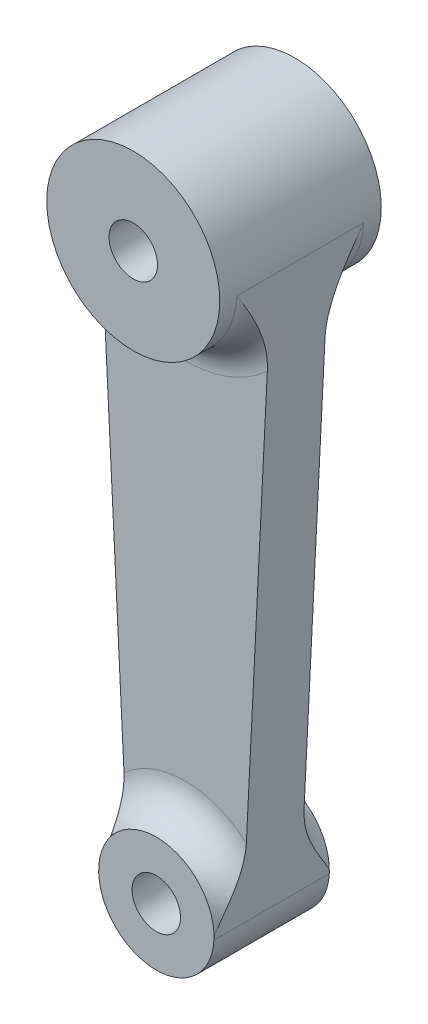
ISO-10303-21;
HEADER;
FILE_DESCRIPTION(('STEP AP214'),'2;1');
FILE_NAME('part.step','',(''),(''),'','','');
FILE_SCHEMA(('AUTOMOTIVE_DESIGN { 1 0 10303 214 1 1 1 1 }'));
ENDSEC;
DATA;
#1=APPLICATION_CONTEXT('core data for automotive mechanical design processes');
#2=APPLICATION_PROTOCOL_DEFINITION('international standard','automotive_design',2000,#1);
#3=PRODUCT_CONTEXT('',#1,'mechanical');
#4=PRODUCT('Part','Part','',(#3));
#5=PRODUCT_RELATED_PRODUCT_CATEGORY('part','',(#4));
#6=PRODUCT_DEFINITION_FORMATION('','',#4);
#7=PRODUCT_DEFINITION_CONTEXT('part definition',#1,'design');
#8=PRODUCT_DEFINITION('design','',#6,#7);
#9=PRODUCT_DEFINITION_SHAPE('','',#8);
#10=(LENGTH_UNIT() NAMED_UNIT(*) SI_UNIT(.MILLI.,.METRE.));
#11=(NAMED_UNIT(*) PLANE_ANGLE_UNIT() SI_UNIT($,.RADIAN.));
#12=(NAMED_UNIT(*) SI_UNIT($,.STERADIAN.) SOLID_ANGLE_UNIT());
#13=UNCERTAINTY_MEASURE_WITH_UNIT(LENGTH_MEASURE(1.E-05),#10,'distance_accuracy_value','');
#14=(GEOMETRIC_REPRESENTATION_CONTEXT(3) GLOBAL_UNCERTAINTY_ASSIGNED_CONTEXT((#13)) GLOBAL_UNIT_ASSIGNED_CONTEXT((#10,
#11,#12)) REPRESENTATION_CONTEXT('',''));
#15=CARTESIAN_POINT('',(0.,0.,0.));
#16=DIRECTION('',(0.,0.,1.));
#17=DIRECTION('',(1.,0.,0.));
#18=AXIS2_PLACEMENT_3D('',#15,#16,#17);
#19=CARTESIAN_POINT('',(0.,0.,7.));
#20=DIRECTION('',(0.,0.,-1.));
#21=DIRECTION('',(-1.,0.,0.));
#22=AXIS2_PLACEMENT_3D('',#19,#20,#21);
#23=CYLINDRICAL_SURFACE('',#22,7.5);
#24=CARTESIAN_POINT('',(0.,0.,-5.5));
#25=DIRECTION('',(0.,0.,1.));
#26=DIRECTION('',(1.,0.,0.));
#27=AXIS2_PLACEMENT_3D('',#24,#25,#26);
#28=CIRCLE('',#27,7.5);
#29=CARTESIAN_POINT('',(7.49061913328932,-0.375,-5.5));
#30=VERTEX_POINT('',#29);
#31=CARTESIAN_POINT('',(-7.49061913328932,-0.375,-5.5));
#32=VERTEX_POINT('',#31);
#33=EDGE_CURVE('E191',#30,#32,#28,.F.);
#34=ORIENTED_EDGE('',*,*,#33,.T.);
#35=DIRECTION('',(0.,0.,-1.));
#36=VECTOR('',#35,1.);
#37=CARTESIAN_POINT('',(-7.49061913328932,-0.375,2.5));
#38=LINE('',#37,#36);
#39=CARTESIAN_POINT('',(-7.49061913328932,-0.375,5.5));
#40=VERTEX_POINT('',#39);
#41=EDGE_CURVE('E66',#40,#32,#38,.T.);
#42=ORIENTED_EDGE('',*,*,#41,.F.);
#43=CARTESIAN_POINT('',(0.,0.,5.5));
#44=DIRECTION('',(0.,0.,1.));
#45=DIRECTION('',(1.,0.,0.));
#46=AXIS2_PLACEMENT_3D('',#43,#44,#45);
#47=CIRCLE('',#46,7.5);
#48=CARTESIAN_POINT('',(7.49061913328932,-0.375,5.5));
#49=VERTEX_POINT('',#48);
#50=EDGE_CURVE('E119',#40,#49,#47,.T.);
#51=ORIENTED_EDGE('',*,*,#50,.T.);
#52=DIRECTION('',(0.,0.,-1.));
#53=VECTOR('',#52,1.);
#54=CARTESIAN_POINT('',(7.49061913328932,-0.375,2.5));
#55=LINE('',#54,#53);
#56=EDGE_CURVE('E74',#49,#30,#55,.T.);
#57=ORIENTED_EDGE('',*,*,#56,.T.);
#58=EDGE_LOOP('',(#34,#42,#51,#57));
#59=FACE_BOUND('',#58,.T.);
#60=CARTESIAN_POINT('',(0.,0.,7.));
#61=DIRECTION('',(0.,0.,1.));
#62=DIRECTION('',(1.,0.,0.));
#63=AXIS2_PLACEMENT_3D('',#60,#61,#62);
#64=CIRCLE('',#63,7.5);
#65=CARTESIAN_POINT('',(7.5,0.,7.));
#66=VERTEX_POINT('',#65);
#67=EDGE_CURVE('E134',#66,#66,#64,.T.);
#68=ORIENTED_EDGE('',*,*,#67,.F.);
#69=EDGE_LOOP('',(#68));
#70=FACE_BOUND('',#69,.T.);
#71=CARTESIAN_POINT('',(0.,0.,-7.));
#72=DIRECTION('',(0.,0.,1.));
#73=DIRECTION('',(1.,0.,0.));
#74=AXIS2_PLACEMENT_3D('',#71,#72,#73);
#75=CIRCLE('',#74,7.5);
#76=CARTESIAN_POINT('',(7.5,0.,-7.));
#77=VERTEX_POINT('',#76);
#78=EDGE_CURVE('E174',#77,#77,#75,.T.);
#79=ORIENTED_EDGE('',*,*,#78,.T.);
#80=EDGE_LOOP('',(#79));
#81=FACE_BOUND('',#80,.T.);
#82=ADVANCED_FACE('F44',(#59,#70,#81),#23,.T.);
#83=CARTESIAN_POINT('',(0.,0.,7.));
#84=DIRECTION('',(0.,0.,1.));
#85=DIRECTION('',(1.,0.,0.));
#86=AXIS2_PLACEMENT_3D('',#83,#84,#85);
#87=PLANE('',#86);
#88=CARTESIAN_POINT('',(0.,0.,7.));
#89=DIRECTION('',(0.,0.,1.));
#90=DIRECTION('',(1.,0.,0.));
#91=AXIS2_PLACEMENT_3D('',#88,#89,#90);
#92=CIRCLE('',#91,2.1);
#93=CARTESIAN_POINT('',(2.1,0.,7.));
#94=VERTEX_POINT('',#93);
#95=EDGE_CURVE('E170',#94,#94,#92,.T.);
#96=ORIENTED_EDGE('',*,*,#95,.F.);
#97=EDGE_LOOP('',(#96));
#98=FACE_BOUND('',#97,.T.);
#99=ORIENTED_EDGE('',*,*,#67,.T.);
#100=EDGE_LOOP('',(#99));
#101=FACE_BOUND('',#100,.T.);
#102=ADVANCED_FACE('F320',(#98,#101),#87,.T.);
#103=CARTESIAN_POINT('',(0.,0.,-7.));
#104=DIRECTION('',(0.,0.,1.));
#105=DIRECTION('',(1.,0.,0.));
#106=AXIS2_PLACEMENT_3D('',#103,#104,#105);
#107=PLANE('',#106);
#108=CARTESIAN_POINT('',(0.,0.,-7.));
#109=DIRECTION('',(0.,0.,1.));
#110=DIRECTION('',(1.,0.,0.));
#111=AXIS2_PLACEMENT_3D('',#108,#109,#110);
#112=CIRCLE('',#111,2.1);
#113=CARTESIAN_POINT('',(2.1,0.,-7.));
#114=VERTEX_POINT('',#113);
#115=EDGE_CURVE('E166',#114,#114,#112,.T.);
#116=ORIENTED_EDGE('',*,*,#115,.T.);
#117=EDGE_LOOP('',(#116));
#118=FACE_BOUND('',#117,.T.);
#119=ORIENTED_EDGE('',*,*,#78,.F.);
#120=EDGE_LOOP('',(#119));
#121=FACE_BOUND('',#120,.T.);
#122=ADVANCED_FACE('F326',(#118,#121),#107,.F.);
#123=CARTESIAN_POINT('',(0.,0.,-7.));
#124=DIRECTION('',(0.,0.,1.));
#125=DIRECTION('',(1.,0.,0.));
#126=AXIS2_PLACEMENT_3D('',#123,#124,#125);
#127=CYLINDRICAL_SURFACE('',#126,2.1);
#128=ORIENTED_EDGE('',*,*,#95,.T.);
#129=EDGE_LOOP('',(#128));
#130=FACE_BOUND('',#129,.T.);
#131=ORIENTED_EDGE('',*,*,#115,.F.);
#132=EDGE_LOOP('',(#131));
#133=FACE_BOUND('',#132,.T.);
#134=ADVANCED_FACE('F332',(#130,#133),#127,.F.);
#135=CARTESIAN_POINT('',(-7.49061913328932,-0.375,2.5));
#136=DIRECTION('',(0.998749217771909,0.05,0.));
#137=DIRECTION('',(-0.05,0.998749217771909,0.));
#138=AXIS2_PLACEMENT_3D('',#135,#136,#137);
#139=PLANE('',#138);
#140=ORIENTED_EDGE('',*,*,#41,.T.);
#141=CARTESIAN_POINT('',(-7.12319567187184,-7.71427789363504,-2.5));
#142=CARTESIAN_POINT('',(-7.13332997002861,-7.51184544650028,-2.50003647372042));
#143=CARTESIAN_POINT('',(-7.14345052547113,-7.30968750986754,-2.51005165177537));
#144=CARTESIAN_POINT('',(-7.16359013456363,-6.90739913332025,-2.54767532431811));
#145=CARTESIAN_POINT('',(-7.17360935438837,-6.70726537406742,-2.57524752562251));
#146=CARTESIAN_POINT('',(-7.20314231699165,-6.1173449080971,-2.67968865505622));
#147=CARTESIAN_POINT('',(-7.22246471230885,-5.73138036392635,-2.77844354910527));
#148=CARTESIAN_POINT('',(-7.25252369181107,-5.13095271862909,-2.96968590803792));
#149=CARTESIAN_POINT('',(-7.26350468652827,-4.91160752094585,-3.04785886760033));
#150=CARTESIAN_POINT('',(-7.2852248959588,-4.47774667737428,-3.21671724388862));
#151=CARTESIAN_POINT('',(-7.29596410790622,-4.26323108673489,-3.30740280366956));
#152=CARTESIAN_POINT('',(-7.32786078613315,-3.62609543816144,-3.59496036574917));
#153=CARTESIAN_POINT('',(-7.34867050848439,-3.21042155975432,-3.80715105990202));
#154=CARTESIAN_POINT('',(-7.38974784221001,-2.38990246122193,-4.2583694583844));
#155=CARTESIAN_POINT('',(-7.41000958339889,-1.98517449796021,-4.49760363551205));
#156=CARTESIAN_POINT('',(-7.4501441223208,-1.18348771088247,-4.98812405987757));
#157=CARTESIAN_POINT('',(-7.47001711652389,-0.786524962580185,-5.23940398543993));
#158=CARTESIAN_POINT('',(-7.49013118334326,-0.384746792538685,-5.49382786833796));
#159=CARTESIAN_POINT('',(-7.4903751583628,-0.379873395340231,-5.4969139353815));
#160=CARTESIAN_POINT('',(-7.49061913328932,-0.375,-5.5));
#161=B_SPLINE_CURVE_WITH_KNOTS('',3,(#141,#142,#143,#144,#145,#146,#147,#148,#149,#150,#151,
#152,#153,#154,#155,#156,#157,#158,#159,#160),.UNSPECIFIED.,.F.,.F.,(4,2,2,2,2,2,2,2,2,4),(0.,
0.607387980270041,1.21352445021802,2.40602105452271,3.10509221769731,3.80417137393162,
5.20401880369082,6.61538556835534,8.02601958000373,8.04334008807951),.UNSPECIFIED.);
#162=CARTESIAN_POINT('',(-7.12319567187184,-7.71427789363504,-2.5));
#163=VERTEX_POINT('',#162);
#164=EDGE_CURVE('E238',#32,#163,#161,.F.);
#165=ORIENTED_EDGE('',*,*,#164,.T.);
#166=DIRECTION('',(0.05,-0.998749217771909,0.));
#167=VECTOR('',#166,1.);
#168=CARTESIAN_POINT('',(-7.49061913328932,-0.375,-2.5));
#169=LINE('',#168,#167);
#170=CARTESIAN_POINT('',(-5.30330383353531,-44.0665888929969,-2.5));
#171=VERTEX_POINT('',#170);
#172=EDGE_CURVE('E146',#163,#171,#169,.T.);
#173=ORIENTED_EDGE('',*,*,#172,.T.);
#174=CARTESIAN_POINT('',(-5.30330383353531,-44.0665888929969,-2.5));
#175=CARTESIAN_POINT('',(-5.28699394567484,-44.3923786478488,-2.50008324229882));
#176=CARTESIAN_POINT('',(-5.27077854051683,-44.716281112197,-2.53209238995934));
#177=CARTESIAN_POINT('',(-5.24688546446782,-45.1935449324792,-2.61854844867202));
#178=CARTESIAN_POINT('',(-5.23903178385103,-45.3504220799322,-2.65349967276641));
#179=CARTESIAN_POINT('',(-5.22346796436115,-45.6613091307535,-2.73459690566512));
#180=CARTESIAN_POINT('',(-5.21575790750291,-45.8153173958765,-2.78074911168374));
#181=CARTESIAN_POINT('',(-5.19864837667832,-46.1570800064265,-2.89523796667059));
#182=CARTESIAN_POINT('',(-5.18929361296086,-46.3439412653316,-2.96624019753401));
#183=CARTESIAN_POINT('',(-5.17084959957738,-46.7123601441181,-3.12077573987955));
#184=CARTESIAN_POINT('',(-5.16176036304987,-46.893917501558,-3.20430967019031));
#185=CARTESIAN_POINT('',(-5.14381606135213,-47.2523546472396,-3.38166230122499));
#186=CARTESIAN_POINT('',(-5.13496149822996,-47.4292244070791,-3.47550113978239));
#187=CARTESIAN_POINT('',(-5.11747246502369,-47.7785675717662,-3.67096103832373));
#188=CARTESIAN_POINT('',(-5.10883798591527,-47.9510411568743,-3.77258177853258));
#189=CARTESIAN_POINT('',(-5.09485300342489,-48.2303909633306,-3.94301340302556));
#190=CARTESIAN_POINT('',(-5.08945425576734,-48.3382308633291,-4.01026038747182));
#191=CARTESIAN_POINT('',(-5.07869833160641,-48.553080280172,-4.14608401230665));
#192=CARTESIAN_POINT('',(-5.07334115815103,-48.6600897361326,-4.21466074891997));
#193=CARTESIAN_POINT('',(-5.06261334714742,-48.8743775930979,-4.3523355574564));
#194=CARTESIAN_POINT('',(-5.05724274156028,-48.98165535568,-4.42143461739689));
#195=CARTESIAN_POINT('',(-5.04645384512753,-49.1971633931368,-4.5580584167122));
#196=CARTESIAN_POINT('',(-5.04103557170013,-49.3053933200826,-4.62558370072486));
#197=CARTESIAN_POINT('',(-5.03137719866178,-49.4983191704225,-4.73924020273511));
#198=CARTESIAN_POINT('',(-5.02717358640446,-49.5822862594988,-4.78656048950198));
#199=CARTESIAN_POINT('',(-5.02074009613232,-49.7107951270358,-4.85149715929263));
#200=CARTESIAN_POINT('',(-5.01858574526309,-49.7538282519447,-4.87204427257889));
#201=CARTESIAN_POINT('',(-5.0142127012548,-49.841179737596,-4.91013961883506));
#202=CARTESIAN_POINT('',(-5.01199405305224,-49.8854972007323,-4.92768988982664));
#203=CARTESIAN_POINT('',(-5.00717965394726,-49.9816647475351,-4.96016204675364));
#204=CARTESIAN_POINT('',(-5.00457228912519,-50.0337468190648,-4.97444874094032));
#205=CARTESIAN_POINT('',(-4.999234379513,-50.1403714800592,-4.99456229062466));
#206=CARTESIAN_POINT('',(-4.99650248712457,-50.1949409877787,-5.00023933926548));
#207=CARTESIAN_POINT('',(-4.99374608885932,-50.2500000000046,-4.99999999998648));
#208=B_SPLINE_CURVE_WITH_KNOTS('',3,(#174,#175,#176,#177,#178,#179,#180,#181,#182,#183,#184,
#185,#186,#187,#188,#189,#190,#191,#192,#193,#194,#195,#196,#197,#198,#199,#200,#201,#202,#203,
#204,#205,#206,#207),.UNSPECIFIED.,.F.,.F.,(4,2,2,2,2,2,2,2,2,2,2,2,2,2,2,2,4),(0.,
0.974310071641202,1.45656716480001,1.93909168908394,2.53886204137582,3.13866202071977,
3.73965571912665,4.34062473464787,4.72222445809966,5.10385189904056,5.48700718230206,
5.87002783633203,6.1592322771183,6.30235834745223,6.44538669296362,6.60694704566487,
6.77128751888901),.UNSPECIFIED.);
#209=CARTESIAN_POINT('',(-4.99374608885955,-50.25,-5.));
#210=VERTEX_POINT('',#209);
#211=EDGE_CURVE('E257',#171,#210,#208,.T.);
#212=ORIENTED_EDGE('',*,*,#211,.T.);
#213=DIRECTION('',(0.,0.,-1.));
#214=VECTOR('',#213,1.);
#215=CARTESIAN_POINT('',(-4.99374608885954,-50.25,2.5));
#216=LINE('',#215,#214);
#217=CARTESIAN_POINT('',(-4.99374608885955,-50.25,5.));
#218=VERTEX_POINT('',#217);
#219=EDGE_CURVE('E163',#218,#210,#216,.T.);
#220=ORIENTED_EDGE('',*,*,#219,.F.);
#221=CARTESIAN_POINT('',(-4.99374608885955,-50.25,5.));
#222=CARTESIAN_POINT('',(-4.99562688471017,-50.2124311323081,5.00009421839753));
#223=CARTESIAN_POINT('',(-4.99750275176238,-50.1749607172872,4.99748582785182));
#224=CARTESIAN_POINT('',(-5.001211169365,-50.1008851336914,4.98772878123328));
#225=CARTESIAN_POINT('',(-5.00304393955132,-50.0642755778925,4.98061440844665));
#226=CARTESIAN_POINT('',(-5.00663034986823,-49.9926370879201,4.96284144045095));
#227=CARTESIAN_POINT('',(-5.00838480975573,-49.9575917791151,4.9522461303797));
#228=CARTESIAN_POINT('',(-5.01185068579159,-49.8883609595209,4.92838760397279));
#229=CARTESIAN_POINT('',(-5.01356200853647,-49.8541773144648,4.91511907857204));
#230=CARTESIAN_POINT('',(-5.01851931144319,-49.7551552664579,4.87344670064389));
#231=CARTESIAN_POINT('',(-5.02171005602203,-49.6914201934133,4.84245651951244));
#232=CARTESIAN_POINT('',(-5.0279962905758,-49.5658527565471,4.77678750659824));
#233=CARTESIAN_POINT('',(-5.03109164166928,-49.5040231668804,4.74210359664907));
#234=CARTESIAN_POINT('',(-5.03723144144981,-49.3813807623187,4.67066218279995));
#235=CARTESIAN_POINT('',(-5.0402757520144,-49.3205707064179,4.63389995646025));
#236=CARTESIAN_POINT('',(-5.04633176247406,-49.1996019922299,4.55931163015022));
#237=CARTESIAN_POINT('',(-5.04934345798355,-49.1394434215445,4.52148538950814));
#238=CARTESIAN_POINT('',(-5.05852789411742,-48.9559844534568,4.40511633995857));
#239=CARTESIAN_POINT('',(-5.06467623089293,-48.8331715225541,4.32580742308507));
#240=CARTESIAN_POINT('',(-5.07698451671496,-48.5873137058168,4.16799687199748));
#241=CARTESIAN_POINT('',(-5.08314443014899,-48.4642695313411,4.08949412660171));
#242=CARTESIAN_POINT('',(-5.09551531367394,-48.2171613264673,3.93479352899047));
#243=CARTESIAN_POINT('',(-5.10172611575688,-48.093100652026,3.85859036168412));
#244=CARTESIAN_POINT('',(-5.11424303153384,-47.8430754552028,3.70938465072734));
#245=CARTESIAN_POINT('',(-5.12054914649392,-47.7171109075317,3.63638214964191));
#246=CARTESIAN_POINT('',(-5.13965448079954,-47.3354821536715,3.42347252118567));
#247=CARTESIAN_POINT('',(-5.15263173293437,-47.0762617453017,3.28977903057819));
#248=CARTESIAN_POINT('',(-5.17896748026952,-46.5502056042933,3.04799742615366));
#249=CARTESIAN_POINT('',(-5.19231849497544,-46.2835192944132,2.93958895009747));
#250=CARTESIAN_POINT('',(-5.21954146537656,-45.7397408865424,2.75373780715585));
#251=CARTESIAN_POINT('',(-5.23341249295137,-45.4626673277417,2.6762425990717));
#252=CARTESIAN_POINT('',(-5.25663716160553,-44.9987549347146,2.58049733810621));
#253=CARTESIAN_POINT('',(-5.26587429617655,-44.8142433161694,2.55100620166412));
#254=CARTESIAN_POINT('',(-5.28450368936601,-44.4421214786586,2.51070364216896));
#255=CARTESIAN_POINT('',(-5.29389654401877,-44.2544993539168,2.50000443438074));
#256=CARTESIAN_POINT('',(-5.30330383353531,-44.0665888929969,2.5));
#257=B_SPLINE_CURVE_WITH_KNOTS('',3,(#221,#222,#223,#224,#225,#226,#227,#228,#229,#230,#231,
#232,#233,#234,#235,#236,#237,#238,#239,#240,#241,#242,#243,#244,#245,#246,#247,#248,#249,#250,
#251,#252,#253,#254,#255,#256),.UNSPECIFIED.,.F.,.F.,(4,2,2,2,2,2,2,2,2,2,2,2,2,2,2,2,2,4),(0.,
0.112601521565427,0.224356452201861,0.334182715871849,0.44422928605026,0.656775416375639,
0.86961762410459,1.08296458427933,1.29633988455262,1.73530709464927,2.17355395929981,
2.61069522884531,3.04784231008278,3.92277536760216,4.78593439723963,5.64762005818688,
6.2079829943392,6.77168088233889),.UNSPECIFIED.);
#258=CARTESIAN_POINT('',(-5.30330383353531,-44.0665888929969,2.5));
#259=VERTEX_POINT('',#258);
#260=EDGE_CURVE('E138',#218,#259,#257,.T.);
#261=ORIENTED_EDGE('',*,*,#260,.T.);
#262=DIRECTION('',(0.05,-0.998749217771909,0.));
#263=VECTOR('',#262,1.);
#264=CARTESIAN_POINT('',(-7.49061913328932,-0.375,2.5));
#265=LINE('',#264,#263);
#266=CARTESIAN_POINT('',(-7.12319567187184,-7.71427789363504,2.5));
#267=VERTEX_POINT('',#266);
#268=EDGE_CURVE('E128',#267,#259,#265,.T.);
#269=ORIENTED_EDGE('',*,*,#268,.F.);
#270=CARTESIAN_POINT('',(-7.12319567187184,-7.71427789363504,2.5));
#271=CARTESIAN_POINT('',(-7.1333299700286,-7.51184544650037,2.50003647372042));
#272=CARTESIAN_POINT('',(-7.14345052547112,-7.30968750986773,2.51005165177536));
#273=CARTESIAN_POINT('',(-7.16359013456361,-6.90739913332061,2.54767532431807));
#274=CARTESIAN_POINT('',(-7.17360935438835,-6.70726537406784,2.57524752562244));
#275=CARTESIAN_POINT('',(-7.20314231699163,-6.11734490809743,2.67968865505614));
#276=CARTESIAN_POINT('',(-7.22246471230885,-5.73138036392651,2.77844354910522));
#277=CARTESIAN_POINT('',(-7.25252369181107,-5.13095271862908,2.96968590803793));
#278=CARTESIAN_POINT('',(-7.26350468652827,-4.91160752094583,3.04785886760034));
#279=CARTESIAN_POINT('',(-7.2852248959588,-4.47774667737424,3.21671724388864));
#280=CARTESIAN_POINT('',(-7.29596410790622,-4.26323108673484,3.3074028036696));
#281=CARTESIAN_POINT('',(-7.32786078613316,-3.62609543816126,3.59496036574921));
#282=CARTESIAN_POINT('',(-7.34867050848441,-3.21042155975398,3.80715105990197));
#283=CARTESIAN_POINT('',(-7.38974784221002,-2.38990246122178,4.25836945838473));
#284=CARTESIAN_POINT('',(-7.41000958339888,-1.98517449796041,4.49760363551284));
#285=CARTESIAN_POINT('',(-7.45014412232082,-1.18348771088194,4.98812405987697));
#286=CARTESIAN_POINT('',(-7.47001711652397,-0.786524962578576,5.23940398543747));
#287=CARTESIAN_POINT('',(-7.49013118334326,-0.384746792538662,5.49382786833788));
#288=CARTESIAN_POINT('',(-7.4903751583628,-0.379873395340219,5.49691393538146));
#289=CARTESIAN_POINT('',(-7.49061913328932,-0.375,5.5));
#290=B_SPLINE_CURVE_WITH_KNOTS('',3,(#270,#271,#272,#273,#274,#275,#276,#277,#278,#279,#280,
#281,#282,#283,#284,#285,#286,#287,#288,#289),.UNSPECIFIED.,.F.,.F.,(4,2,2,2,2,2,2,2,2,4),(0.,
0.607387980269757,1.21352445021751,2.40602105452271,3.10509221769734,3.8041713739317,
5.20401880369117,6.61538556835554,8.0260195800037,8.04334008807951),.UNSPECIFIED.);
#291=EDGE_CURVE('E59',#267,#40,#290,.T.);
#292=ORIENTED_EDGE('',*,*,#291,.T.);
#293=EDGE_LOOP('',(#140,#165,#173,#212,#220,#261,#269,#292));
#294=FACE_BOUND('',#293,.T.);
#295=ADVANCED_FACE('F136',(#294),#139,.F.);
#296=CARTESIAN_POINT('',(7.49061913328932,-0.375,2.5));
#297=DIRECTION('',(0.998749217771909,-0.05,0.));
#298=DIRECTION('',(0.05,0.998749217771909,0.));
#299=AXIS2_PLACEMENT_3D('',#296,#297,#298);
#300=PLANE('',#299);
#301=DIRECTION('',(-0.05,-0.998749217771909,0.));
#302=VECTOR('',#301,1.);
#303=CARTESIAN_POINT('',(7.49061913328932,-0.375,-2.5));
#304=LINE('',#303,#302);
#305=CARTESIAN_POINT('',(7.12319567187184,-7.71427789363504,-2.5));
#306=VERTEX_POINT('',#305);
#307=CARTESIAN_POINT('',(5.30330383353531,-44.0665888929969,-2.5));
#308=VERTEX_POINT('',#307);
#309=EDGE_CURVE('E140',#306,#308,#304,.T.);
#310=ORIENTED_EDGE('',*,*,#309,.F.);
#311=CARTESIAN_POINT('',(7.12319567187184,-7.71427789363504,-2.5));
#312=CARTESIAN_POINT('',(7.13332997002861,-7.51184544650028,-2.50003647372042));
#313=CARTESIAN_POINT('',(7.14345052547113,-7.30968750986754,-2.51005165177537));
#314=CARTESIAN_POINT('',(7.16359013456363,-6.90739913332025,-2.54767532431811));
#315=CARTESIAN_POINT('',(7.17360935438837,-6.70726537406742,-2.57524752562251));
#316=CARTESIAN_POINT('',(7.20314231699165,-6.1173449080971,-2.67968865505622));
#317=CARTESIAN_POINT('',(7.22246471230885,-5.73138036392635,-2.77844354910527));
#318=CARTESIAN_POINT('',(7.25252369181107,-5.13095271862909,-2.96968590803792));
#319=CARTESIAN_POINT('',(7.26350468652827,-4.91160752094585,-3.04785886760033));
#320=CARTESIAN_POINT('',(7.2852248959588,-4.47774667737428,-3.21671724388862));
#321=CARTESIAN_POINT('',(7.29596410790622,-4.26323108673489,-3.30740280366956));
#322=CARTESIAN_POINT('',(7.32786078613315,-3.62609543816144,-3.59496036574917));
#323=CARTESIAN_POINT('',(7.34867050848439,-3.21042155975432,-3.80715105990202));
#324=CARTESIAN_POINT('',(7.38974784221001,-2.38990246122193,-4.2583694583844));
#325=CARTESIAN_POINT('',(7.41000958339889,-1.98517449796021,-4.49760363551205));
#326=CARTESIAN_POINT('',(7.4501441223208,-1.18348771088247,-4.98812405987757));
#327=CARTESIAN_POINT('',(7.47001711652389,-0.786524962580185,-5.23940398543993));
#328=CARTESIAN_POINT('',(7.49013118334326,-0.384746792538685,-5.49382786833796));
#329=CARTESIAN_POINT('',(7.4903751583628,-0.379873395340231,-5.4969139353815));
#330=CARTESIAN_POINT('',(7.49061913328932,-0.375,-5.5));
#331=B_SPLINE_CURVE_WITH_KNOTS('',3,(#311,#312,#313,#314,#315,#316,#317,#318,#319,#320,#321,
#322,#323,#324,#325,#326,#327,#328,#329,#330),.UNSPECIFIED.,.F.,.F.,(4,2,2,2,2,2,2,2,2,4),(0.,
0.607387980270041,1.21352445021802,2.40602105452271,3.10509221769731,3.80417137393162,
5.20401880369082,6.61538556835534,8.02601958000373,8.04334008807951),.UNSPECIFIED.);
#332=EDGE_CURVE('E122',#306,#30,#331,.T.);
#333=ORIENTED_EDGE('',*,*,#332,.T.);
#334=ORIENTED_EDGE('',*,*,#56,.F.);
#335=CARTESIAN_POINT('',(7.12319567187184,-7.71427789363504,2.5));
#336=CARTESIAN_POINT('',(7.1333299700286,-7.51184544650037,2.50003647372042));
#337=CARTESIAN_POINT('',(7.14345052547112,-7.30968750986773,2.51005165177536));
#338=CARTESIAN_POINT('',(7.16359013456361,-6.90739913332061,2.54767532431807));
#339=CARTESIAN_POINT('',(7.17360935438835,-6.70726537406784,2.57524752562244));
#340=CARTESIAN_POINT('',(7.20314231699163,-6.11734490809743,2.67968865505614));
#341=CARTESIAN_POINT('',(7.22246471230885,-5.73138036392651,2.77844354910522));
#342=CARTESIAN_POINT('',(7.25252369181107,-5.13095271862908,2.96968590803793));
#343=CARTESIAN_POINT('',(7.26350468652827,-4.91160752094583,3.04785886760034));
#344=CARTESIAN_POINT('',(7.2852248959588,-4.47774667737424,3.21671724388864));
#345=CARTESIAN_POINT('',(7.29596410790622,-4.26323108673484,3.3074028036696));
#346=CARTESIAN_POINT('',(7.32786078613316,-3.62609543816126,3.59496036574921));
#347=CARTESIAN_POINT('',(7.34867050848441,-3.21042155975398,3.80715105990197));
#348=CARTESIAN_POINT('',(7.38974784221002,-2.38990246122178,4.25836945838473));
#349=CARTESIAN_POINT('',(7.41000958339888,-1.98517449796041,4.49760363551284));
#350=CARTESIAN_POINT('',(7.45014412232082,-1.18348771088194,4.98812405987697));
#351=CARTESIAN_POINT('',(7.47001711652397,-0.786524962578576,5.23940398543747));
#352=CARTESIAN_POINT('',(7.49013118334326,-0.384746792538662,5.49382786833788));
#353=CARTESIAN_POINT('',(7.4903751583628,-0.379873395340219,5.49691393538146));
#354=CARTESIAN_POINT('',(7.49061913328932,-0.375,5.5));
#355=B_SPLINE_CURVE_WITH_KNOTS('',3,(#335,#336,#337,#338,#339,#340,#341,#342,#343,#344,#345,
#346,#347,#348,#349,#350,#351,#352,#353,#354),.UNSPECIFIED.,.F.,.F.,(4,2,2,2,2,2,2,2,2,4),(0.,
0.607387980269757,1.21352445021751,2.40602105452271,3.10509221769734,3.8041713739317,
5.20401880369117,6.61538556835554,8.0260195800037,8.04334008807951),.UNSPECIFIED.);
#356=CARTESIAN_POINT('',(7.12319567187184,-7.71427789363504,2.5));
#357=VERTEX_POINT('',#356);
#358=EDGE_CURVE('E11',#49,#357,#355,.F.);
#359=ORIENTED_EDGE('',*,*,#358,.T.);
#360=DIRECTION('',(-0.05,-0.998749217771909,0.));
#361=VECTOR('',#360,1.);
#362=CARTESIAN_POINT('',(7.49061913328932,-0.375,2.5));
#363=LINE('',#362,#361);
#364=CARTESIAN_POINT('',(5.30330383353531,-44.0665888929969,2.5));
#365=VERTEX_POINT('',#364);
#366=EDGE_CURVE('E131',#357,#365,#363,.T.);
#367=ORIENTED_EDGE('',*,*,#366,.T.);
#368=CARTESIAN_POINT('',(5.30330383353531,-44.0665888929969,2.5));
#369=CARTESIAN_POINT('',(5.28699394567484,-44.3923786478488,2.50008324229882));
#370=CARTESIAN_POINT('',(5.27077854051683,-44.716281112197,2.53209238995934));
#371=CARTESIAN_POINT('',(5.24688546446782,-45.1935449324792,2.61854844867202));
#372=CARTESIAN_POINT('',(5.23903178385103,-45.3504220799322,2.65349967276641));
#373=CARTESIAN_POINT('',(5.22346796436115,-45.6613091307535,2.73459690566512));
#374=CARTESIAN_POINT('',(5.21575790750291,-45.8153173958765,2.78074911168374));
#375=CARTESIAN_POINT('',(5.19864837667832,-46.1570800064265,2.89523796667059));
#376=CARTESIAN_POINT('',(5.18929361296086,-46.3439412653316,2.96624019753401));
#377=CARTESIAN_POINT('',(5.17084959957738,-46.7123601441181,3.12077573987955));
#378=CARTESIAN_POINT('',(5.16176036304987,-46.893917501558,3.20430967019031));
#379=CARTESIAN_POINT('',(5.14381606135213,-47.2523546472396,3.38166230122499));
#380=CARTESIAN_POINT('',(5.13496149822996,-47.4292244070791,3.47550113978239));
#381=CARTESIAN_POINT('',(5.11747246502369,-47.7785675717662,3.67096103832373));
#382=CARTESIAN_POINT('',(5.10883798591527,-47.9510411568743,3.77258177853258));
#383=CARTESIAN_POINT('',(5.09485300342489,-48.2303909633306,3.94301340302556));
#384=CARTESIAN_POINT('',(5.08945425576734,-48.3382308633291,4.01026038747182));
#385=CARTESIAN_POINT('',(5.07869833160641,-48.553080280172,4.14608401230665));
#386=CARTESIAN_POINT('',(5.07334115815103,-48.6600897361326,4.21466074891997));
#387=CARTESIAN_POINT('',(5.06261334714742,-48.8743775930979,4.3523355574564));
#388=CARTESIAN_POINT('',(5.05724274156028,-48.98165535568,4.42143461739689));
#389=CARTESIAN_POINT('',(5.04645384512753,-49.1971633931368,4.5580584167122));
#390=CARTESIAN_POINT('',(5.04103557170013,-49.3053933200826,4.62558370072486));
#391=CARTESIAN_POINT('',(5.03137719866178,-49.4983191704225,4.73924020273511));
#392=CARTESIAN_POINT('',(5.02717358640446,-49.5822862594988,4.78656048950198));
#393=CARTESIAN_POINT('',(5.02074009613232,-49.7107951270358,4.85149715929263));
#394=CARTESIAN_POINT('',(5.01858574526309,-49.7538282519447,4.87204427257889));
#395=CARTESIAN_POINT('',(5.0142127012548,-49.841179737596,4.91013961883506));
#396=CARTESIAN_POINT('',(5.01199405305224,-49.8854972007323,4.92768988982664));
#397=CARTESIAN_POINT('',(5.00717965394726,-49.9816647475351,4.96016204675364));
#398=CARTESIAN_POINT('',(5.00457228912519,-50.0337468190648,4.97444874094032));
#399=CARTESIAN_POINT('',(4.999234379513,-50.1403714800592,4.99456229062466));
#400=CARTESIAN_POINT('',(4.99650248712457,-50.1949409877787,5.00023933926548));
#401=CARTESIAN_POINT('',(4.99374608885932,-50.2500000000046,4.99999999998648));
#402=B_SPLINE_CURVE_WITH_KNOTS('',3,(#368,#369,#370,#371,#372,#373,#374,#375,#376,#377,#378,
#379,#380,#381,#382,#383,#384,#385,#386,#387,#388,#389,#390,#391,#392,#393,#394,#395,#396,#397,
#398,#399,#400,#401),.UNSPECIFIED.,.F.,.F.,(4,2,2,2,2,2,2,2,2,2,2,2,2,2,2,2,4),(0.,
0.974310071641202,1.45656716480001,1.93909168908394,2.53886204137582,3.13866202071977,
3.73965571912665,4.34062473464787,4.72222445809966,5.10385189904056,5.48700718230206,
5.87002783633203,6.1592322771183,6.30235834745223,6.44538669296362,6.60694704566487,
6.77128751888901),.UNSPECIFIED.);
#403=CARTESIAN_POINT('',(4.99374608885955,-50.25,5.));
#404=VERTEX_POINT('',#403);
#405=EDGE_CURVE('E194',#365,#404,#402,.T.);
#406=ORIENTED_EDGE('',*,*,#405,.T.);
#407=DIRECTION('',(0.,0.,-1.));
#408=VECTOR('',#407,1.);
#409=CARTESIAN_POINT('',(4.99374608885954,-50.25,2.5));
#410=LINE('',#409,#408);
#411=CARTESIAN_POINT('',(4.99374608885955,-50.25,-5.));
#412=VERTEX_POINT('',#411);
#413=EDGE_CURVE('E160',#404,#412,#410,.T.);
#414=ORIENTED_EDGE('',*,*,#413,.T.);
#415=CARTESIAN_POINT('',(4.99374608885955,-50.25,-5.));
#416=CARTESIAN_POINT('',(4.99562688471017,-50.2124311323081,-5.00009421839753));
#417=CARTESIAN_POINT('',(4.99750275176238,-50.1749607172872,-4.99748582785182));
#418=CARTESIAN_POINT('',(5.001211169365,-50.1008851336914,-4.98772878123328));
#419=CARTESIAN_POINT('',(5.00304393955132,-50.0642755778925,-4.98061440844665));
#420=CARTESIAN_POINT('',(5.00663034986823,-49.9926370879201,-4.96284144045095));
#421=CARTESIAN_POINT('',(5.00838480975573,-49.9575917791151,-4.9522461303797));
#422=CARTESIAN_POINT('',(5.01185068579159,-49.8883609595209,-4.92838760397279));
#423=CARTESIAN_POINT('',(5.01356200853647,-49.8541773144648,-4.91511907857204));
#424=CARTESIAN_POINT('',(5.01851931144319,-49.7551552664579,-4.87344670064389));
#425=CARTESIAN_POINT('',(5.02171005602203,-49.6914201934133,-4.84245651951244));
#426=CARTESIAN_POINT('',(5.0279962905758,-49.5658527565471,-4.77678750659824));
#427=CARTESIAN_POINT('',(5.03109164166928,-49.5040231668804,-4.74210359664907));
#428=CARTESIAN_POINT('',(5.03723144144981,-49.3813807623187,-4.67066218279995));
#429=CARTESIAN_POINT('',(5.0402757520144,-49.3205707064179,-4.63389995646025));
#430=CARTESIAN_POINT('',(5.04633176247406,-49.1996019922299,-4.55931163015022));
#431=CARTESIAN_POINT('',(5.04934345798355,-49.1394434215445,-4.52148538950814));
#432=CARTESIAN_POINT('',(5.05852789411742,-48.9559844534568,-4.40511633995857));
#433=CARTESIAN_POINT('',(5.06467623089293,-48.8331715225541,-4.32580742308507));
#434=CARTESIAN_POINT('',(5.07698451671496,-48.5873137058168,-4.16799687199748));
#435=CARTESIAN_POINT('',(5.08314443014899,-48.4642695313411,-4.08949412660171));
#436=CARTESIAN_POINT('',(5.09551531367394,-48.2171613264673,-3.93479352899047));
#437=CARTESIAN_POINT('',(5.10172611575688,-48.093100652026,-3.85859036168412));
#438=CARTESIAN_POINT('',(5.11424303153384,-47.8430754552028,-3.70938465072734));
#439=CARTESIAN_POINT('',(5.12054914649392,-47.7171109075317,-3.63638214964191));
#440=CARTESIAN_POINT('',(5.13965448079954,-47.3354821536715,-3.42347252118567));
#441=CARTESIAN_POINT('',(5.15263173293437,-47.0762617453017,-3.28977903057819));
#442=CARTESIAN_POINT('',(5.17896748026952,-46.5502056042933,-3.04799742615366));
#443=CARTESIAN_POINT('',(5.19231849497544,-46.2835192944132,-2.93958895009747));
#444=CARTESIAN_POINT('',(5.21954146537656,-45.7397408865424,-2.75373780715585));
#445=CARTESIAN_POINT('',(5.23341249295137,-45.4626673277417,-2.6762425990717));
#446=CARTESIAN_POINT('',(5.25663716160553,-44.9987549347146,-2.58049733810621));
#447=CARTESIAN_POINT('',(5.26587429617655,-44.8142433161694,-2.55100620166412));
#448=CARTESIAN_POINT('',(5.28450368936601,-44.4421214786586,-2.51070364216896));
#449=CARTESIAN_POINT('',(5.29389654401877,-44.2544993539168,-2.50000443438074));
#450=CARTESIAN_POINT('',(5.30330383353531,-44.0665888929969,-2.5));
#451=B_SPLINE_CURVE_WITH_KNOTS('',3,(#415,#416,#417,#418,#419,#420,#421,#422,#423,#424,#425,
#426,#427,#428,#429,#430,#431,#432,#433,#434,#435,#436,#437,#438,#439,#440,#441,#442,#443,#444,
#445,#446,#447,#448,#449,#450),.UNSPECIFIED.,.F.,.F.,(4,2,2,2,2,2,2,2,2,2,2,2,2,2,2,2,2,4),(0.,
0.112601521565427,0.224356452201861,0.334182715871849,0.44422928605026,0.656775416375639,
0.86961762410459,1.08296458427933,1.29633988455262,1.73530709464927,2.17355395929981,
2.61069522884531,3.04784231008278,3.92277536760216,4.78593439723963,5.64762005818688,
6.2079829943392,6.77168088233889),.UNSPECIFIED.);
#452=EDGE_CURVE('E225',#412,#308,#451,.T.);
#453=ORIENTED_EDGE('',*,*,#452,.T.);
#454=EDGE_LOOP('',(#310,#333,#334,#359,#367,#406,#414,#453));
#455=FACE_BOUND('',#454,.T.);
#456=ADVANCED_FACE('F213',(#455),#300,.T.);
#457=CARTESIAN_POINT('',(0.,0.,2.5));
#458=DIRECTION('',(0.,0.,1.));
#459=DIRECTION('',(1.,0.,0.));
#460=AXIS2_PLACEMENT_3D('',#457,#458,#459);
#461=PLANE('',#460);
#462=ORIENTED_EDGE('',*,*,#268,.T.);
#463=CARTESIAN_POINT('',(0.,-50.,2.5));
#464=DIRECTION('',(0.,0.,1.));
#465=DIRECTION('',(1.,0.,0.));
#466=AXIS2_PLACEMENT_3D('',#463,#464,#465);
#467=CIRCLE('',#466,7.95803989154981);
#468=EDGE_CURVE('E133',#259,#365,#467,.F.);
#469=ORIENTED_EDGE('',*,*,#468,.T.);
#470=ORIENTED_EDGE('',*,*,#366,.F.);
#471=CARTESIAN_POINT('',(0.,0.,2.5));
#472=DIRECTION('',(0.,0.,1.));
#473=DIRECTION('',(1.,0.,0.));
#474=AXIS2_PLACEMENT_3D('',#471,#472,#473);
#475=CIRCLE('',#474,10.5);
#476=EDGE_CURVE('E118',#357,#267,#475,.F.);
#477=ORIENTED_EDGE('',*,*,#476,.T.);
#478=EDGE_LOOP('',(#462,#469,#470,#477));
#479=FACE_BOUND('',#478,.T.);
#480=ADVANCED_FACE('F126',(#479),#461,.T.);
#481=CARTESIAN_POINT('',(0.,0.,-2.5));
#482=DIRECTION('',(0.,0.,1.));
#483=DIRECTION('',(1.,0.,0.));
#484=AXIS2_PLACEMENT_3D('',#481,#482,#483);
#485=PLANE('',#484);
#486=ORIENTED_EDGE('',*,*,#309,.T.);
#487=CARTESIAN_POINT('',(0.,-50.,-2.5));
#488=DIRECTION('',(0.,0.,1.));
#489=DIRECTION('',(1.,0.,0.));
#490=AXIS2_PLACEMENT_3D('',#487,#488,#489);
#491=CIRCLE('',#490,7.95803989154981);
#492=EDGE_CURVE('E186',#308,#171,#491,.T.);
#493=ORIENTED_EDGE('',*,*,#492,.T.);
#494=ORIENTED_EDGE('',*,*,#172,.F.);
#495=CARTESIAN_POINT('',(0.,0.,-2.5));
#496=DIRECTION('',(0.,0.,1.));
#497=DIRECTION('',(1.,0.,0.));
#498=AXIS2_PLACEMENT_3D('',#495,#496,#497);
#499=CIRCLE('',#498,10.5);
#500=EDGE_CURVE('E183',#163,#306,#499,.T.);
#501=ORIENTED_EDGE('',*,*,#500,.T.);
#502=EDGE_LOOP('',(#486,#493,#494,#501));
#503=FACE_BOUND('',#502,.T.);
#504=ADVANCED_FACE('F218',(#503),#485,.F.);
#505=CARTESIAN_POINT('',(0.,-50.,5.));
#506=DIRECTION('',(0.,0.,-1.));
#507=DIRECTION('',(-1.,0.,0.));
#508=AXIS2_PLACEMENT_3D('',#505,#506,#507);
#509=CYLINDRICAL_SURFACE('',#508,5.);
#510=ORIENTED_EDGE('',*,*,#413,.F.);
#511=CARTESIAN_POINT('',(0.,-50.,5.));
#512=DIRECTION('',(0.,0.,1.));
#513=DIRECTION('',(1.,0.,0.));
#514=AXIS2_PLACEMENT_3D('',#511,#512,#513);
#515=CIRCLE('',#514,5.);
#516=EDGE_CURVE('E154',#404,#218,#515,.F.);
#517=ORIENTED_EDGE('',*,*,#516,.T.);
#518=ORIENTED_EDGE('',*,*,#219,.T.);
#519=CARTESIAN_POINT('',(0.,-50.,-5.));
#520=DIRECTION('',(0.,0.,1.));
#521=DIRECTION('',(1.,0.,0.));
#522=AXIS2_PLACEMENT_3D('',#519,#520,#521);
#523=CIRCLE('',#522,5.);
#524=EDGE_CURVE('E149',#412,#210,#523,.F.);
#525=ORIENTED_EDGE('',*,*,#524,.F.);
#526=EDGE_LOOP('',(#510,#517,#518,#525));
#527=FACE_BOUND('',#526,.T.);
#528=ADVANCED_FACE('F306',(#527),#509,.T.);
#529=CARTESIAN_POINT('',(0.,0.,5.));
#530=DIRECTION('',(0.,0.,1.));
#531=DIRECTION('',(1.,0.,0.));
#532=AXIS2_PLACEMENT_3D('',#529,#530,#531);
#533=PLANE('',#532);
#534=CARTESIAN_POINT('',(0.,-50.,5.));
#535=DIRECTION('',(0.,0.,1.));
#536=DIRECTION('',(1.,0.,0.));
#537=AXIS2_PLACEMENT_3D('',#534,#535,#536);
#538=CIRCLE('',#537,2.1);
#539=CARTESIAN_POINT('',(2.1,-50.,5.));
#540=VERTEX_POINT('',#539);
#541=EDGE_CURVE('E287',#540,#540,#538,.T.);
#542=ORIENTED_EDGE('',*,*,#541,.F.);
#543=EDGE_LOOP('',(#542));
#544=FACE_BOUND('',#543,.T.);
#545=ORIENTED_EDGE('',*,*,#516,.F.);
#546=EDGE_CURVE('E285',#218,#404,#515,.F.);
#547=ORIENTED_EDGE('',*,*,#546,.F.);
#548=EDGE_LOOP('',(#545,#547));
#549=FACE_BOUND('',#548,.T.);
#550=ADVANCED_FACE('F303',(#544,#549),#533,.T.);
#551=CARTESIAN_POINT('',(0.,0.,-5.));
#552=DIRECTION('',(0.,0.,1.));
#553=DIRECTION('',(1.,0.,0.));
#554=AXIS2_PLACEMENT_3D('',#551,#552,#553);
#555=PLANE('',#554);
#556=CARTESIAN_POINT('',(0.,-50.,-5.));
#557=DIRECTION('',(0.,0.,1.));
#558=DIRECTION('',(1.,0.,0.));
#559=AXIS2_PLACEMENT_3D('',#556,#557,#558);
#560=CIRCLE('',#559,2.1);
#561=CARTESIAN_POINT('',(2.1,-50.,-5.));
#562=VERTEX_POINT('',#561);
#563=EDGE_CURVE('E282',#562,#562,#560,.F.);
#564=ORIENTED_EDGE('',*,*,#563,.F.);
#565=EDGE_LOOP('',(#564));
#566=FACE_BOUND('',#565,.T.);
#567=ORIENTED_EDGE('',*,*,#524,.T.);
#568=EDGE_CURVE('E278',#210,#412,#523,.F.);
#569=ORIENTED_EDGE('',*,*,#568,.T.);
#570=EDGE_LOOP('',(#567,#569));
#571=FACE_BOUND('',#570,.T.);
#572=ADVANCED_FACE('F305',(#566,#571),#555,.F.);
#573=CARTESIAN_POINT('',(0.,-50.,5.5));
#574=DIRECTION('',(0.,0.,1.));
#575=DIRECTION('',(1.,0.,0.));
#576=AXIS2_PLACEMENT_3D('',#573,#574,#575);
#577=TOROIDAL_SURFACE('',#576,7.95803989154981,3.);
#578=ORIENTED_EDGE('',*,*,#260,.F.);
#579=ORIENTED_EDGE('',*,*,#546,.T.);
#580=ORIENTED_EDGE('',*,*,#405,.F.);
#581=ORIENTED_EDGE('',*,*,#468,.F.);
#582=EDGE_LOOP('',(#578,#579,#580,#581));
#583=FACE_BOUND('',#582,.T.);
#584=ADVANCED_FACE('F209',(#583),#577,.F.);
#585=CARTESIAN_POINT('',(0.,-50.,-5.5));
#586=DIRECTION('',(0.,0.,1.));
#587=DIRECTION('',(1.,0.,0.));
#588=AXIS2_PLACEMENT_3D('',#585,#586,#587);
#589=TOROIDAL_SURFACE('',#588,7.95803989154981,3.);
#590=ORIENTED_EDGE('',*,*,#211,.F.);
#591=ORIENTED_EDGE('',*,*,#492,.F.);
#592=ORIENTED_EDGE('',*,*,#452,.F.);
#593=ORIENTED_EDGE('',*,*,#568,.F.);
#594=EDGE_LOOP('',(#590,#591,#592,#593));
#595=FACE_BOUND('',#594,.T.);
#596=ADVANCED_FACE('F250',(#595),#589,.F.);
#597=CARTESIAN_POINT('',(0.,0.,-5.5));
#598=DIRECTION('',(0.,0.,1.));
#599=DIRECTION('',(1.,0.,0.));
#600=AXIS2_PLACEMENT_3D('',#597,#598,#599);
#601=TOROIDAL_SURFACE('',#600,10.5,3.);
#602=ORIENTED_EDGE('',*,*,#332,.F.);
#603=ORIENTED_EDGE('',*,*,#500,.F.);
#604=ORIENTED_EDGE('',*,*,#164,.F.);
#605=ORIENTED_EDGE('',*,*,#33,.F.);
#606=EDGE_LOOP('',(#602,#603,#604,#605));
#607=FACE_BOUND('',#606,.T.);
#608=ADVANCED_FACE('F247',(#607),#601,.F.);
#609=CARTESIAN_POINT('',(0.,0.,5.5));
#610=DIRECTION('',(0.,0.,1.));
#611=DIRECTION('',(1.,0.,0.));
#612=AXIS2_PLACEMENT_3D('',#609,#610,#611);
#613=TOROIDAL_SURFACE('',#612,10.5,3.);
#614=ORIENTED_EDGE('',*,*,#358,.F.);
#615=ORIENTED_EDGE('',*,*,#50,.F.);
#616=ORIENTED_EDGE('',*,*,#291,.F.);
#617=ORIENTED_EDGE('',*,*,#476,.F.);
#618=EDGE_LOOP('',(#614,#615,#616,#617));
#619=FACE_BOUND('',#618,.T.);
#620=ADVANCED_FACE('F46',(#619),#613,.F.);
#621=CARTESIAN_POINT('',(0.,-50.,-7.001));
#622=DIRECTION('',(0.,0.,1.));
#623=DIRECTION('',(1.,0.,0.));
#624=AXIS2_PLACEMENT_3D('',#621,#622,#623);
#625=CYLINDRICAL_SURFACE('',#624,2.1);
#626=ORIENTED_EDGE('',*,*,#541,.T.);
#627=EDGE_LOOP('',(#626));
#628=FACE_BOUND('',#627,.T.);
#629=ORIENTED_EDGE('',*,*,#563,.T.);
#630=EDGE_LOOP('',(#629));
#631=FACE_BOUND('',#630,.T.);
#632=ADVANCED_FACE('F396',(#628,#631),#625,.F.);
#633=CLOSED_SHELL('',(#82,#102,#122,#134,#295,#456,#480,#504,#528,#550,#572,#584,#596,#608,#620,#632));
#634=MANIFOLD_SOLID_BREP('B2',#633);
#635=ADVANCED_BREP_SHAPE_REPRESENTATION('',(#18,#634),#14);
#636=SHAPE_DEFINITION_REPRESENTATION(#9,#635);
ENDSEC;
END-ISO-10303-21;
